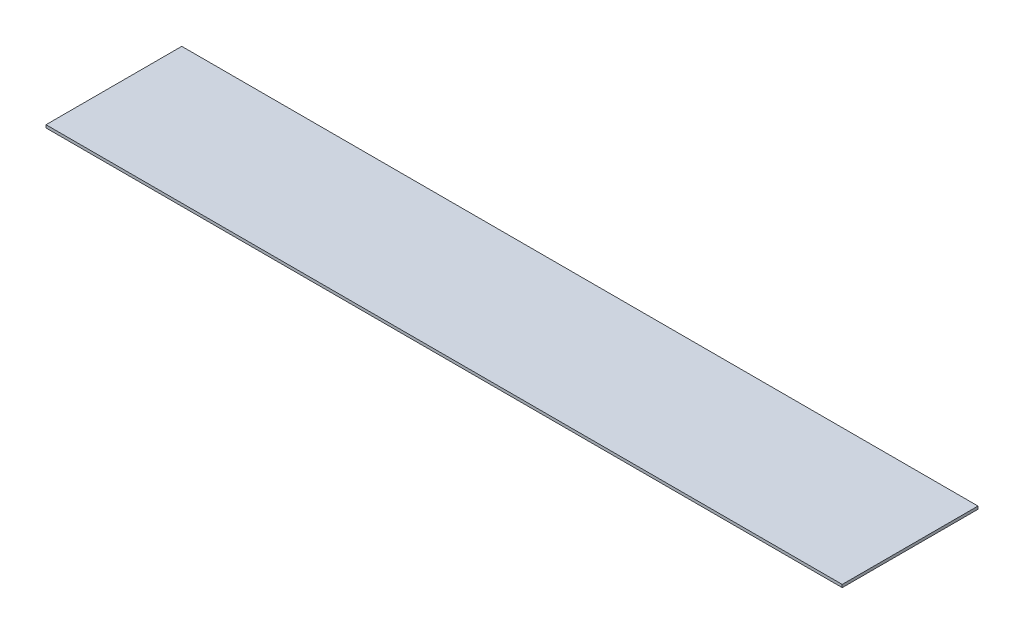
ISO-10303-21;
HEADER;
FILE_DESCRIPTION(('STEP AP214'),'2;1');
FILE_NAME('part.step','',(''),(''),'','','');
FILE_SCHEMA(('AUTOMOTIVE_DESIGN { 1 0 10303 214 1 1 1 1 }'));
ENDSEC;
DATA;
#1=APPLICATION_CONTEXT('core data for automotive mechanical design processes');
#2=APPLICATION_PROTOCOL_DEFINITION('international standard','automotive_design',2000,#1);
#3=PRODUCT_CONTEXT('',#1,'mechanical');
#4=PRODUCT('Part','Part','',(#3));
#5=PRODUCT_RELATED_PRODUCT_CATEGORY('part','',(#4));
#6=PRODUCT_DEFINITION_FORMATION('','',#4);
#7=PRODUCT_DEFINITION_CONTEXT('part definition',#1,'design');
#8=PRODUCT_DEFINITION('design','',#6,#7);
#9=PRODUCT_DEFINITION_SHAPE('','',#8);
#10=(LENGTH_UNIT() NAMED_UNIT(*) SI_UNIT(.MILLI.,.METRE.));
#11=(NAMED_UNIT(*) PLANE_ANGLE_UNIT() SI_UNIT($,.RADIAN.));
#12=(NAMED_UNIT(*) SI_UNIT($,.STERADIAN.) SOLID_ANGLE_UNIT());
#13=UNCERTAINTY_MEASURE_WITH_UNIT(LENGTH_MEASURE(1.E-05),#10,'distance_accuracy_value','');
#14=(GEOMETRIC_REPRESENTATION_CONTEXT(3) GLOBAL_UNCERTAINTY_ASSIGNED_CONTEXT((#13)) GLOBAL_UNIT_ASSIGNED_CONTEXT((#10,
#11,#12)) REPRESENTATION_CONTEXT('',''));
#15=CARTESIAN_POINT('',(0.,0.,0.));
#16=DIRECTION('',(0.,0.,1.));
#17=DIRECTION('',(1.,0.,0.));
#18=AXIS2_PLACEMENT_3D('',#15,#16,#17);
#19=CARTESIAN_POINT('',(893.7625,6.35,152.4));
#20=DIRECTION('',(-1.,0.,0.));
#21=DIRECTION('',(0.,0.,1.));
#22=AXIS2_PLACEMENT_3D('',#19,#20,#21);
#23=PLANE('',#22);
#24=DIRECTION('',(0.,0.,-1.));
#25=VECTOR('',#24,1.);
#26=CARTESIAN_POINT('',(893.7625,0.,152.4));
#27=LINE('',#26,#25);
#28=CARTESIAN_POINT('',(893.7625,0.,152.4));
#29=VERTEX_POINT('',#28);
#30=CARTESIAN_POINT('',(893.7625,0.,-152.4));
#31=VERTEX_POINT('',#30);
#32=EDGE_CURVE('E111',#29,#31,#27,.T.);
#33=ORIENTED_EDGE('',*,*,#32,.T.);
#34=DIRECTION('',(0.,-1.,0.));
#35=VECTOR('',#34,1.);
#36=CARTESIAN_POINT('',(893.7625,6.35,-152.4));
#37=LINE('',#36,#35);
#38=CARTESIAN_POINT('',(893.7625,6.35,-152.4));
#39=VERTEX_POINT('',#38);
#40=EDGE_CURVE('E11',#39,#31,#37,.T.);
#41=ORIENTED_EDGE('',*,*,#40,.F.);
#42=DIRECTION('',(0.,0.,-1.));
#43=VECTOR('',#42,1.);
#44=CARTESIAN_POINT('',(893.7625,6.35,152.4));
#45=LINE('',#44,#43);
#46=CARTESIAN_POINT('',(893.7625,6.35,152.4));
#47=VERTEX_POINT('',#46);
#48=EDGE_CURVE('E95',#47,#39,#45,.T.);
#49=ORIENTED_EDGE('',*,*,#48,.F.);
#50=DIRECTION('',(0.,-1.,0.));
#51=VECTOR('',#50,1.);
#52=CARTESIAN_POINT('',(893.7625,6.35,152.4));
#53=LINE('',#52,#51);
#54=EDGE_CURVE('E107',#47,#29,#53,.T.);
#55=ORIENTED_EDGE('',*,*,#54,.T.);
#56=EDGE_LOOP('',(#33,#41,#49,#55));
#57=FACE_BOUND('',#56,.T.);
#58=ADVANCED_FACE('F43',(#57),#23,.F.);
#59=CARTESIAN_POINT('',(-893.7625,6.35,-152.4));
#60=DIRECTION('',(0.,0.,1.));
#61=DIRECTION('',(1.,0.,0.));
#62=AXIS2_PLACEMENT_3D('',#59,#60,#61);
#63=PLANE('',#62);
#64=DIRECTION('',(-1.,0.,0.));
#65=VECTOR('',#64,1.);
#66=CARTESIAN_POINT('',(-893.7625,0.,-152.4));
#67=LINE('',#66,#65);
#68=CARTESIAN_POINT('',(-893.7625,0.,-152.4));
#69=VERTEX_POINT('',#68);
#70=EDGE_CURVE('E100',#31,#69,#67,.T.);
#71=ORIENTED_EDGE('',*,*,#70,.T.);
#72=DIRECTION('',(0.,-1.,0.));
#73=VECTOR('',#72,1.);
#74=CARTESIAN_POINT('',(-893.7625,6.35,-152.4));
#75=LINE('',#74,#73);
#76=CARTESIAN_POINT('',(-893.7625,6.35,-152.4));
#77=VERTEX_POINT('',#76);
#78=EDGE_CURVE('E52',#77,#69,#75,.T.);
#79=ORIENTED_EDGE('',*,*,#78,.F.);
#80=DIRECTION('',(-1.,0.,0.));
#81=VECTOR('',#80,1.);
#82=CARTESIAN_POINT('',(-893.7625,6.35,-152.4));
#83=LINE('',#82,#81);
#84=EDGE_CURVE('E90',#39,#77,#83,.T.);
#85=ORIENTED_EDGE('',*,*,#84,.F.);
#86=ORIENTED_EDGE('',*,*,#40,.T.);
#87=EDGE_LOOP('',(#71,#79,#85,#86));
#88=FACE_BOUND('',#87,.T.);
#89=ADVANCED_FACE('F99',(#88),#63,.F.);
#90=CARTESIAN_POINT('',(-893.7625,6.35,152.4));
#91=DIRECTION('',(1.,0.,0.));
#92=DIRECTION('',(0.,0.,-1.));
#93=AXIS2_PLACEMENT_3D('',#90,#91,#92);
#94=PLANE('',#93);
#95=DIRECTION('',(0.,0.,1.));
#96=VECTOR('',#95,1.);
#97=CARTESIAN_POINT('',(-893.7625,0.,152.4));
#98=LINE('',#97,#96);
#99=CARTESIAN_POINT('',(-893.7625,0.,152.4));
#100=VERTEX_POINT('',#99);
#101=EDGE_CURVE('E77',#69,#100,#98,.T.);
#102=ORIENTED_EDGE('',*,*,#101,.T.);
#103=DIRECTION('',(0.,-1.,0.));
#104=VECTOR('',#103,1.);
#105=CARTESIAN_POINT('',(-893.7625,6.35,152.4));
#106=LINE('',#105,#104);
#107=CARTESIAN_POINT('',(-893.7625,6.35,152.4));
#108=VERTEX_POINT('',#107);
#109=EDGE_CURVE('E102',#108,#100,#106,.T.);
#110=ORIENTED_EDGE('',*,*,#109,.F.);
#111=DIRECTION('',(0.,0.,1.));
#112=VECTOR('',#111,1.);
#113=CARTESIAN_POINT('',(-893.7625,6.35,152.4));
#114=LINE('',#113,#112);
#115=EDGE_CURVE('E93',#77,#108,#114,.T.);
#116=ORIENTED_EDGE('',*,*,#115,.F.);
#117=ORIENTED_EDGE('',*,*,#78,.T.);
#118=EDGE_LOOP('',(#102,#110,#116,#117));
#119=FACE_BOUND('',#118,.T.);
#120=ADVANCED_FACE('F103',(#119),#94,.F.);
#121=CARTESIAN_POINT('',(-893.7625,6.35,152.4));
#122=DIRECTION('',(0.,0.,-1.));
#123=DIRECTION('',(-1.,0.,0.));
#124=AXIS2_PLACEMENT_3D('',#121,#122,#123);
#125=PLANE('',#124);
#126=DIRECTION('',(1.,0.,0.));
#127=VECTOR('',#126,1.);
#128=CARTESIAN_POINT('',(-893.7625,0.,152.4));
#129=LINE('',#128,#127);
#130=EDGE_CURVE('E83',#100,#29,#129,.T.);
#131=ORIENTED_EDGE('',*,*,#130,.T.);
#132=ORIENTED_EDGE('',*,*,#54,.F.);
#133=DIRECTION('',(1.,0.,0.));
#134=VECTOR('',#133,1.);
#135=CARTESIAN_POINT('',(-893.7625,6.35,152.4));
#136=LINE('',#135,#134);
#137=EDGE_CURVE('E60',#108,#47,#136,.T.);
#138=ORIENTED_EDGE('',*,*,#137,.F.);
#139=ORIENTED_EDGE('',*,*,#109,.T.);
#140=EDGE_LOOP('',(#131,#132,#138,#139));
#141=FACE_BOUND('',#140,.T.);
#142=ADVANCED_FACE('F124',(#141),#125,.F.);
#143=CARTESIAN_POINT('',(0.,6.35,0.));
#144=DIRECTION('',(0.,-1.,0.));
#145=DIRECTION('',(0.,0.,-1.));
#146=AXIS2_PLACEMENT_3D('',#143,#144,#145);
#147=PLANE('',#146);
#148=ORIENTED_EDGE('',*,*,#48,.T.);
#149=ORIENTED_EDGE('',*,*,#84,.T.);
#150=ORIENTED_EDGE('',*,*,#115,.T.);
#151=ORIENTED_EDGE('',*,*,#137,.T.);
#152=EDGE_LOOP('',(#148,#149,#150,#151));
#153=FACE_BOUND('',#152,.T.);
#154=ADVANCED_FACE('F91',(#153),#147,.F.);
#155=CARTESIAN_POINT('',(0.,0.,0.));
#156=DIRECTION('',(0.,-1.,0.));
#157=DIRECTION('',(0.,0.,-1.));
#158=AXIS2_PLACEMENT_3D('',#155,#156,#157);
#159=PLANE('',#158);
#160=ORIENTED_EDGE('',*,*,#32,.F.);
#161=ORIENTED_EDGE('',*,*,#130,.F.);
#162=ORIENTED_EDGE('',*,*,#101,.F.);
#163=ORIENTED_EDGE('',*,*,#70,.F.);
#164=EDGE_LOOP('',(#160,#161,#162,#163));
#165=FACE_BOUND('',#164,.T.);
#166=ADVANCED_FACE('F127',(#165),#159,.T.);
#167=CLOSED_SHELL('',(#58,#89,#120,#142,#154,#166));
#168=MANIFOLD_SOLID_BREP('B2',#167);
#169=ADVANCED_BREP_SHAPE_REPRESENTATION('',(#18,#168),#14);
#170=SHAPE_DEFINITION_REPRESENTATION(#9,#169);
ENDSEC;
END-ISO-10303-21;
